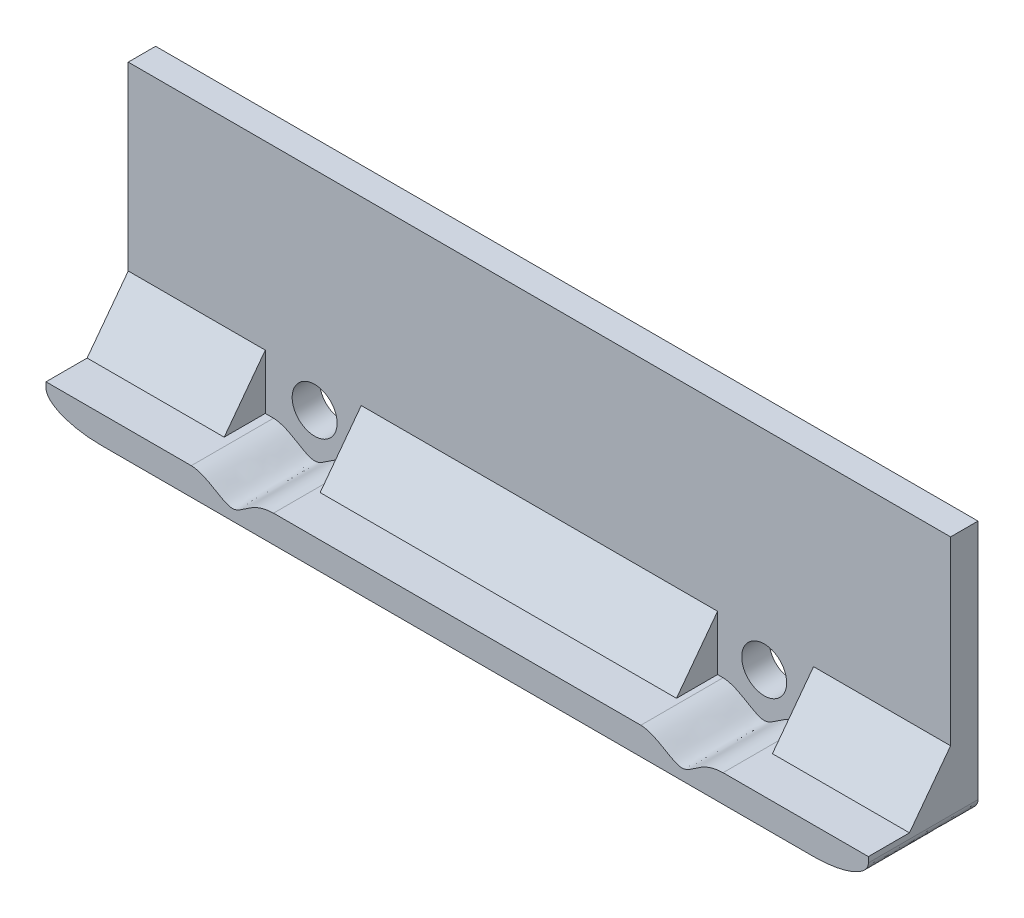
ISO-10303-21;
HEADER;
FILE_DESCRIPTION(('STEP AP214'),'2;1');
FILE_NAME('part.step','',(''),(''),'','','');
FILE_SCHEMA(('AUTOMOTIVE_DESIGN { 1 0 10303 214 1 1 1 1 }'));
ENDSEC;
DATA;
#1=APPLICATION_CONTEXT('core data for automotive mechanical design processes');
#2=APPLICATION_PROTOCOL_DEFINITION('international standard','automotive_design',2000,#1);
#3=PRODUCT_CONTEXT('',#1,'mechanical');
#4=PRODUCT('Part','Part','',(#3));
#5=PRODUCT_RELATED_PRODUCT_CATEGORY('part','',(#4));
#6=PRODUCT_DEFINITION_FORMATION('','',#4);
#7=PRODUCT_DEFINITION_CONTEXT('part definition',#1,'design');
#8=PRODUCT_DEFINITION('design','',#6,#7);
#9=PRODUCT_DEFINITION_SHAPE('','',#8);
#10=(LENGTH_UNIT() NAMED_UNIT(*) SI_UNIT(.MILLI.,.METRE.));
#11=(NAMED_UNIT(*) PLANE_ANGLE_UNIT() SI_UNIT($,.RADIAN.));
#12=(NAMED_UNIT(*) SI_UNIT($,.STERADIAN.) SOLID_ANGLE_UNIT());
#13=UNCERTAINTY_MEASURE_WITH_UNIT(LENGTH_MEASURE(1.E-05),#10,'distance_accuracy_value','');
#14=(GEOMETRIC_REPRESENTATION_CONTEXT(3) GLOBAL_UNCERTAINTY_ASSIGNED_CONTEXT((#13)) GLOBAL_UNIT_ASSIGNED_CONTEXT((#10,
#11,#12)) REPRESENTATION_CONTEXT('',''));
#15=CARTESIAN_POINT('',(0.,0.,0.));
#16=DIRECTION('',(0.,0.,1.));
#17=DIRECTION('',(1.,0.,0.));
#18=AXIS2_PLACEMENT_3D('',#15,#16,#17);
#19=CARTESIAN_POINT('',(0.,0.,5.));
#20=DIRECTION('',(0.,0.,-1.));
#21=DIRECTION('',(-1.,0.,0.));
#22=AXIS2_PLACEMENT_3D('',#19,#20,#21);
#23=PLANE('',#22);
#24=CARTESIAN_POINT('',(41.,10.,5.));
#25=DIRECTION('',(0.,0.,1.));
#26=DIRECTION('',(1.,0.,0.));
#27=AXIS2_PLACEMENT_3D('',#24,#25,#26);
#28=CIRCLE('',#27,4.1);
#29=CARTESIAN_POINT('',(45.1,10.,5.));
#30=VERTEX_POINT('',#29);
#31=EDGE_CURVE('E453',#30,#30,#28,.T.);
#32=ORIENTED_EDGE('',*,*,#31,.F.);
#33=EDGE_LOOP('',(#32));
#34=FACE_BOUND('',#33,.T.);
#35=CARTESIAN_POINT('',(-41.,9.99999999999999,5.));
#36=DIRECTION('',(0.,0.,1.));
#37=DIRECTION('',(1.,0.,0.));
#38=AXIS2_PLACEMENT_3D('',#35,#36,#37);
#39=CIRCLE('',#38,4.1);
#40=CARTESIAN_POINT('',(-36.9,9.99999999999999,5.));
#41=VERTEX_POINT('',#40);
#42=EDGE_CURVE('E366',#41,#41,#39,.T.);
#43=ORIENTED_EDGE('',*,*,#42,.F.);
#44=EDGE_LOOP('',(#43));
#45=FACE_BOUND('',#44,.T.);
#46=DIRECTION('',(1.,0.,0.));
#47=VECTOR('',#46,1.);
#48=CARTESIAN_POINT('',(0.,5.,5.));
#49=LINE('',#48,#47);
#50=CARTESIAN_POINT('',(-33.5,5.,5.));
#51=VERTEX_POINT('',#50);
#52=CARTESIAN_POINT('',(-32.5,4.99999999999545,4.99999999999545));
#53=VERTEX_POINT('',#52);
#54=EDGE_CURVE('E213',#51,#53,#49,.T.);
#55=ORIENTED_EDGE('',*,*,#54,.T.);
#56=DIRECTION('',(0.,1.,0.));
#57=VECTOR('',#56,1.);
#58=CARTESIAN_POINT('',(-32.5,-291521.0249875,4.99999999999545));
#59=LINE('',#58,#57);
#60=CARTESIAN_POINT('',(-32.5,15.0000000000432,4.99999999993861));
#61=VERTEX_POINT('',#60);
#62=EDGE_CURVE('E206',#53,#61,#59,.T.);
#63=ORIENTED_EDGE('',*,*,#62,.T.);
#64=DIRECTION('',(1.,0.,0.));
#65=VECTOR('',#64,1.);
#66=CARTESIAN_POINT('',(-32.5,15.0000000000432,4.99999999993861));
#67=LINE('',#66,#65);
#68=CARTESIAN_POINT('',(32.5,15.0000000000432,4.99999999993861));
#69=VERTEX_POINT('',#68);
#70=EDGE_CURVE('E189',#61,#69,#67,.T.);
#71=ORIENTED_EDGE('',*,*,#70,.T.);
#72=DIRECTION('',(0.,1.,0.));
#73=VECTOR('',#72,1.);
#74=CARTESIAN_POINT('',(32.5,-291521.0249875,4.99999999999545));
#75=LINE('',#74,#73);
#76=CARTESIAN_POINT('',(32.5,4.99999999999545,4.99999999999545));
#77=VERTEX_POINT('',#76);
#78=EDGE_CURVE('E222',#77,#69,#75,.T.);
#79=ORIENTED_EDGE('',*,*,#78,.F.);
#80=CARTESIAN_POINT('',(33.5,5.,5.));
#81=VERTEX_POINT('',#80);
#82=EDGE_CURVE('E475',#77,#81,#49,.T.);
#83=ORIENTED_EDGE('',*,*,#82,.T.);
#84=CARTESIAN_POINT('',(33.5,5.,5.));
#85=CARTESIAN_POINT('',(36.4768103069263,4.895138538773,5.));
#86=CARTESIAN_POINT('',(41.6709900792615,-0.89512850250222,5.));
#87=CARTESIAN_POINT('',(44.1812095345506,4.89511846623144,5.));
#88=CARTESIAN_POINT('',(48.5,5.,5.));
#89=B_SPLINE_CURVE_WITH_KNOTS('',3,(#84,#85,#86,#87,#88),.UNSPECIFIED.,.F.,.F.,(4,1,4),(0.,0.5,
1.),.UNSPECIFIED.);
#90=CARTESIAN_POINT('',(48.5,5.,5.));
#91=VERTEX_POINT('',#90);
#92=EDGE_CURVE('E461',#81,#91,#89,.T.);
#93=ORIENTED_EDGE('',*,*,#92,.T.);
#94=DIRECTION('',(1.,0.,0.));
#95=VECTOR('',#94,1.);
#96=CARTESIAN_POINT('',(0.,5.,5.));
#97=LINE('',#96,#95);
#98=CARTESIAN_POINT('',(50.,5.,5.));
#99=VERTEX_POINT('',#98);
#100=EDGE_CURVE('E487',#91,#99,#97,.T.);
#101=ORIENTED_EDGE('',*,*,#100,.T.);
#102=DIRECTION('',(0.,-1.,0.));
#103=VECTOR('',#102,1.);
#104=CARTESIAN_POINT('',(50.,0.,5.));
#105=LINE('',#104,#103);
#106=CARTESIAN_POINT('',(50.,15.,5.));
#107=VERTEX_POINT('',#106);
#108=EDGE_CURVE('E234',#107,#99,#105,.T.);
#109=ORIENTED_EDGE('',*,*,#108,.F.);
#110=DIRECTION('',(1.,0.,0.));
#111=VECTOR('',#110,1.);
#112=CARTESIAN_POINT('',(50.,15.,5.));
#113=LINE('',#112,#111);
#114=CARTESIAN_POINT('',(75.,15.,5.));
#115=VERTEX_POINT('',#114);
#116=EDGE_CURVE('E249',#107,#115,#113,.T.);
#117=ORIENTED_EDGE('',*,*,#116,.T.);
#118=DIRECTION('',(0.,1.,0.));
#119=VECTOR('',#118,1.);
#120=CARTESIAN_POINT('',(75.,0.,5.));
#121=LINE('',#120,#119);
#122=CARTESIAN_POINT('',(75.,48.,5.));
#123=VERTEX_POINT('',#122);
#124=EDGE_CURVE('E436',#115,#123,#121,.T.);
#125=ORIENTED_EDGE('',*,*,#124,.T.);
#126=DIRECTION('',(-1.,0.,0.));
#127=VECTOR('',#126,1.);
#128=CARTESIAN_POINT('',(-75.,48.,5.));
#129=LINE('',#128,#127);
#130=CARTESIAN_POINT('',(-75.,48.,5.));
#131=VERTEX_POINT('',#130);
#132=EDGE_CURVE('E370',#123,#131,#129,.T.);
#133=ORIENTED_EDGE('',*,*,#132,.T.);
#134=DIRECTION('',(0.,-1.,0.));
#135=VECTOR('',#134,1.);
#136=CARTESIAN_POINT('',(-75.,0.,5.));
#137=LINE('',#136,#135);
#138=CARTESIAN_POINT('',(-75.,15.,5.));
#139=VERTEX_POINT('',#138);
#140=EDGE_CURVE('E433',#131,#139,#137,.T.);
#141=ORIENTED_EDGE('',*,*,#140,.T.);
#142=DIRECTION('',(-1.,0.,0.));
#143=VECTOR('',#142,1.);
#144=CARTESIAN_POINT('',(-50.,15.,5.));
#145=LINE('',#144,#143);
#146=CARTESIAN_POINT('',(-50.,15.,5.));
#147=VERTEX_POINT('',#146);
#148=EDGE_CURVE('E269',#147,#139,#145,.T.);
#149=ORIENTED_EDGE('',*,*,#148,.F.);
#150=DIRECTION('',(0.,-1.,0.));
#151=VECTOR('',#150,1.);
#152=CARTESIAN_POINT('',(-50.,15.,5.));
#153=LINE('',#152,#151);
#154=CARTESIAN_POINT('',(-50.,5.,5.));
#155=VERTEX_POINT('',#154);
#156=EDGE_CURVE('E253',#147,#155,#153,.T.);
#157=ORIENTED_EDGE('',*,*,#156,.T.);
#158=DIRECTION('',(1.,0.,0.));
#159=VECTOR('',#158,1.);
#160=CARTESIAN_POINT('',(0.,5.,5.));
#161=LINE('',#160,#159);
#162=CARTESIAN_POINT('',(-48.5,5.,5.));
#163=VERTEX_POINT('',#162);
#164=EDGE_CURVE('E481',#155,#163,#161,.T.);
#165=ORIENTED_EDGE('',*,*,#164,.T.);
#166=CARTESIAN_POINT('',(-48.5,5.,5.));
#167=CARTESIAN_POINT('',(-45.5231896930737,4.895138538773,5.));
#168=CARTESIAN_POINT('',(-40.3290099207385,-0.895128502502221,5.));
#169=CARTESIAN_POINT('',(-37.8187904654494,4.89511846623144,5.));
#170=CARTESIAN_POINT('',(-33.5,5.,5.));
#171=B_SPLINE_CURVE_WITH_KNOTS('',3,(#166,#167,#168,#169,#170),.UNSPECIFIED.,.F.,.F.,(4,1,4),
(0.,0.5,1.),.UNSPECIFIED.);
#172=EDGE_CURVE('E476',#163,#51,#171,.T.);
#173=ORIENTED_EDGE('',*,*,#172,.T.);
#174=EDGE_LOOP('',(#55,#63,#71,#79,#83,#93,#101,#109,#117,#125,#133,#141,#149,#157,#165,#173));
#175=FACE_BOUND('',#174,.T.);
#176=ADVANCED_FACE('F50',(#34,#45,#175),#23,.F.);
#177=CARTESIAN_POINT('',(0.,5.,20.));
#178=DIRECTION('',(0.,1.,0.));
#179=DIRECTION('',(0.,0.,1.));
#180=AXIS2_PLACEMENT_3D('',#177,#178,#179);
#181=PLANE('',#180);
#182=DIRECTION('',(0.,0.,-1.));
#183=VECTOR('',#182,1.);
#184=CARTESIAN_POINT('',(75.,5.,20.));
#185=LINE('',#184,#183);
#186=CARTESIAN_POINT('',(75.,5.,20.));
#187=VERTEX_POINT('',#186);
#188=CARTESIAN_POINT('',(75.,5.,12.5));
#189=VERTEX_POINT('',#188);
#190=EDGE_CURVE('E506',#187,#189,#185,.T.);
#191=ORIENTED_EDGE('',*,*,#190,.T.);
#192=DIRECTION('',(1.,0.,0.));
#193=VECTOR('',#192,1.);
#194=CARTESIAN_POINT('',(50.,5.,12.5));
#195=LINE('',#194,#193);
#196=CARTESIAN_POINT('',(50.,5.,12.5));
#197=VERTEX_POINT('',#196);
#198=EDGE_CURVE('E242',#197,#189,#195,.T.);
#199=ORIENTED_EDGE('',*,*,#198,.F.);
#200=DIRECTION('',(0.,0.,1.));
#201=VECTOR('',#200,1.);
#202=CARTESIAN_POINT('',(50.,5.,5.));
#203=LINE('',#202,#201);
#204=EDGE_CURVE('E238',#99,#197,#203,.T.);
#205=ORIENTED_EDGE('',*,*,#204,.F.);
#206=ORIENTED_EDGE('',*,*,#100,.F.);
#207=DIRECTION('',(0.,0.,-1.));
#208=VECTOR('',#207,1.);
#209=CARTESIAN_POINT('',(48.5,5.,20.));
#210=LINE('',#209,#208);
#211=CARTESIAN_POINT('',(48.5,5.,20.));
#212=VERTEX_POINT('',#211);
#213=EDGE_CURVE('E393',#212,#91,#210,.T.);
#214=ORIENTED_EDGE('',*,*,#213,.F.);
#215=DIRECTION('',(1.,0.,0.));
#216=VECTOR('',#215,1.);
#217=CARTESIAN_POINT('',(0.,5.,20.));
#218=LINE('',#217,#216);
#219=EDGE_CURVE('E399',#212,#187,#218,.T.);
#220=ORIENTED_EDGE('',*,*,#219,.T.);
#221=EDGE_LOOP('',(#191,#199,#205,#206,#214,#220));
#222=FACE_BOUND('',#221,.T.);
#223=ADVANCED_FACE('F307',(#222),#181,.T.);
#224=CARTESIAN_POINT('',(0.,0.,0.));
#225=DIRECTION('',(0.,0.,-1.));
#226=DIRECTION('',(-1.,0.,0.));
#227=AXIS2_PLACEMENT_3D('',#224,#225,#226);
#228=PLANE('',#227);
#229=DIRECTION('',(0.,1.,0.));
#230=VECTOR('',#229,1.);
#231=CARTESIAN_POINT('',(75.,0.,0.));
#232=LINE('',#231,#230);
#233=CARTESIAN_POINT('',(75.,4.00000000000002,0.));
#234=VERTEX_POINT('',#233);
#235=CARTESIAN_POINT('',(75.,48.,0.));
#236=VERTEX_POINT('',#235);
#237=EDGE_CURVE('E379',#234,#236,#232,.T.);
#238=ORIENTED_EDGE('',*,*,#237,.F.);
#239=CARTESIAN_POINT('',(65.,0.,0.));
#240=CARTESIAN_POINT('',(75.,0.,0.));
#241=CARTESIAN_POINT('',(75.,4.00000000000002,0.));
#242=(BOUNDED_CURVE() B_SPLINE_CURVE(2,(#239,#240,#241),.UNSPECIFIED.,.F.,
.F.) B_SPLINE_CURVE_WITH_KNOTS((3,3),(0.,1.),
.UNSPECIFIED.) CURVE() GEOMETRIC_REPRESENTATION_ITEM() RATIONAL_B_SPLINE_CURVE((1.,
0.707106781186547,1.)) REPRESENTATION_ITEM(''));
#243=CARTESIAN_POINT('',(65.,0.,0.));
#244=VERTEX_POINT('',#243);
#245=EDGE_CURVE('E80',#234,#244,#242,.F.);
#246=ORIENTED_EDGE('',*,*,#245,.T.);
#247=DIRECTION('',(1.,0.,0.));
#248=VECTOR('',#247,1.);
#249=CARTESIAN_POINT('',(-75.,0.,0.));
#250=LINE('',#249,#248);
#251=CARTESIAN_POINT('',(-65.,0.,0.));
#252=VERTEX_POINT('',#251);
#253=EDGE_CURVE('E365',#252,#244,#250,.T.);
#254=ORIENTED_EDGE('',*,*,#253,.F.);
#255=CARTESIAN_POINT('',(-75.,4.,0.));
#256=CARTESIAN_POINT('',(-75.,0.,0.));
#257=CARTESIAN_POINT('',(-65.,0.,0.));
#258=(BOUNDED_CURVE() B_SPLINE_CURVE(2,(#255,#256,#257),.UNSPECIFIED.,.F.,
.F.) B_SPLINE_CURVE_WITH_KNOTS((3,3),(0.,1.),
.UNSPECIFIED.) CURVE() GEOMETRIC_REPRESENTATION_ITEM() RATIONAL_B_SPLINE_CURVE((1.,
0.707106781186548,1.)) REPRESENTATION_ITEM(''));
#259=CARTESIAN_POINT('',(-75.,4.,0.));
#260=VERTEX_POINT('',#259);
#261=EDGE_CURVE('E612',#252,#260,#258,.F.);
#262=ORIENTED_EDGE('',*,*,#261,.T.);
#263=DIRECTION('',(0.,-1.,0.));
#264=VECTOR('',#263,1.);
#265=CARTESIAN_POINT('',(-75.,0.,0.));
#266=LINE('',#265,#264);
#267=CARTESIAN_POINT('',(-75.,48.,0.));
#268=VERTEX_POINT('',#267);
#269=EDGE_CURVE('E356',#268,#260,#266,.T.);
#270=ORIENTED_EDGE('',*,*,#269,.F.);
#271=DIRECTION('',(-1.,0.,0.));
#272=VECTOR('',#271,1.);
#273=CARTESIAN_POINT('',(-75.,48.,0.));
#274=LINE('',#273,#272);
#275=EDGE_CURVE('E405',#236,#268,#274,.T.);
#276=ORIENTED_EDGE('',*,*,#275,.F.);
#277=EDGE_LOOP('',(#238,#246,#254,#262,#270,#276));
#278=FACE_BOUND('',#277,.T.);
#279=CARTESIAN_POINT('',(-41.,9.99999999999999,0.));
#280=DIRECTION('',(0.,0.,1.));
#281=DIRECTION('',(1.,0.,0.));
#282=AXIS2_PLACEMENT_3D('',#279,#280,#281);
#283=CIRCLE('',#282,4.1);
#284=CARTESIAN_POINT('',(-36.9,9.99999999999999,0.));
#285=VERTEX_POINT('',#284);
#286=EDGE_CURVE('E449',#285,#285,#283,.T.);
#287=ORIENTED_EDGE('',*,*,#286,.T.);
#288=EDGE_LOOP('',(#287));
#289=FACE_BOUND('',#288,.T.);
#290=CARTESIAN_POINT('',(41.,10.,0.));
#291=DIRECTION('',(0.,0.,1.));
#292=DIRECTION('',(1.,0.,0.));
#293=AXIS2_PLACEMENT_3D('',#290,#291,#292);
#294=CIRCLE('',#293,4.1);
#295=CARTESIAN_POINT('',(45.1,10.,0.));
#296=VERTEX_POINT('',#295);
#297=EDGE_CURVE('E457',#296,#296,#294,.T.);
#298=ORIENTED_EDGE('',*,*,#297,.T.);
#299=EDGE_LOOP('',(#298));
#300=FACE_BOUND('',#299,.T.);
#301=ADVANCED_FACE('F309',(#278,#289,#300),#228,.T.);
#302=CARTESIAN_POINT('',(-75.,0.,5.));
#303=DIRECTION('',(1.,0.,0.));
#304=DIRECTION('',(0.,0.,-1.));
#305=AXIS2_PLACEMENT_3D('',#302,#303,#304);
#306=PLANE('',#305);
#307=ORIENTED_EDGE('',*,*,#269,.T.);
#308=CARTESIAN_POINT('',(-75.,4.,21.));
#309=CARTESIAN_POINT('',(-75.,4.,13.6666666666667));
#310=CARTESIAN_POINT('',(-75.,4.,6.33333333333333));
#311=CARTESIAN_POINT('',(-75.,4.,-0.999999999999997));
#312=(BOUNDED_CURVE() B_SPLINE_CURVE(3,(#308,#309,#310,#311),.UNSPECIFIED.,.F.,
.F.) B_SPLINE_CURVE_WITH_KNOTS((4,4),(-0.016,0.006),
.UNSPECIFIED.) CURVE() GEOMETRIC_REPRESENTATION_ITEM() RATIONAL_B_SPLINE_CURVE((1.,1.,1.,1.)) REPRESENTATION_ITEM(''));
#313=CARTESIAN_POINT('',(-75.,4.,20.));
#314=VERTEX_POINT('',#313);
#315=EDGE_CURVE('E544',#260,#314,#312,.F.);
#316=ORIENTED_EDGE('',*,*,#315,.T.);
#317=DIRECTION('',(0.,1.,0.));
#318=VECTOR('',#317,1.);
#319=CARTESIAN_POINT('',(-75.,0.,20.));
#320=LINE('',#319,#318);
#321=CARTESIAN_POINT('',(-75.,5.,20.));
#322=VERTEX_POINT('',#321);
#323=EDGE_CURVE('E386',#314,#322,#320,.T.);
#324=ORIENTED_EDGE('',*,*,#323,.T.);
#325=DIRECTION('',(0.,0.,-1.));
#326=VECTOR('',#325,1.);
#327=CARTESIAN_POINT('',(-75.,5.,20.));
#328=LINE('',#327,#326);
#329=CARTESIAN_POINT('',(-75.,5.,12.5));
#330=VERTEX_POINT('',#329);
#331=EDGE_CURVE('E503',#322,#330,#328,.T.);
#332=ORIENTED_EDGE('',*,*,#331,.T.);
#333=DIRECTION('',(0.,0.8,-0.6));
#334=VECTOR('',#333,1.);
#335=CARTESIAN_POINT('',(-75.,5.,12.5));
#336=LINE('',#335,#334);
#337=EDGE_CURVE('E252',#330,#139,#336,.T.);
#338=ORIENTED_EDGE('',*,*,#337,.T.);
#339=ORIENTED_EDGE('',*,*,#140,.F.);
#340=DIRECTION('',(0.,0.,-1.));
#341=VECTOR('',#340,1.);
#342=CARTESIAN_POINT('',(-75.,48.,5.));
#343=LINE('',#342,#341);
#344=EDGE_CURVE('E438',#131,#268,#343,.T.);
#345=ORIENTED_EDGE('',*,*,#344,.T.);
#346=EDGE_LOOP('',(#307,#316,#324,#332,#338,#339,#345));
#347=FACE_BOUND('',#346,.T.);
#348=ADVANCED_FACE('F313',(#347),#306,.F.);
#349=CARTESIAN_POINT('',(-75.,0.,5.));
#350=DIRECTION('',(0.,1.,0.));
#351=DIRECTION('',(-1.,0.,0.));
#352=AXIS2_PLACEMENT_3D('',#349,#350,#351);
#353=PLANE('',#352);
#354=ORIENTED_EDGE('',*,*,#253,.T.);
#355=CARTESIAN_POINT('',(65.,0.,21.));
#356=CARTESIAN_POINT('',(65.,0.,13.6666666666667));
#357=CARTESIAN_POINT('',(65.,0.,6.33333333333333));
#358=CARTESIAN_POINT('',(65.,0.,-0.999999999999997));
#359=(BOUNDED_CURVE() B_SPLINE_CURVE(3,(#355,#356,#357,#358),.UNSPECIFIED.,.F.,
.F.) B_SPLINE_CURVE_WITH_KNOTS((4,4),(-0.016,0.006),
.UNSPECIFIED.) CURVE() GEOMETRIC_REPRESENTATION_ITEM() RATIONAL_B_SPLINE_CURVE((1.,1.,1.,1.)) REPRESENTATION_ITEM(''));
#360=CARTESIAN_POINT('',(65.,0.,20.));
#361=VERTEX_POINT('',#360);
#362=EDGE_CURVE('E65',#244,#361,#359,.F.);
#363=ORIENTED_EDGE('',*,*,#362,.T.);
#364=DIRECTION('',(1.,0.,0.));
#365=VECTOR('',#364,1.);
#366=CARTESIAN_POINT('',(0.,0.,20.));
#367=LINE('',#366,#365);
#368=CARTESIAN_POINT('',(-65.,0.,20.));
#369=VERTEX_POINT('',#368);
#370=EDGE_CURVE('E382',#369,#361,#367,.T.);
#371=ORIENTED_EDGE('',*,*,#370,.F.);
#372=CARTESIAN_POINT('',(-65.,0.,-0.999999999999997));
#373=CARTESIAN_POINT('',(-65.,0.,6.33333333333333));
#374=CARTESIAN_POINT('',(-65.,0.,13.6666666666667));
#375=CARTESIAN_POINT('',(-65.,0.,21.));
#376=(BOUNDED_CURVE() B_SPLINE_CURVE(3,(#372,#373,#374,#375),.UNSPECIFIED.,.F.,
.F.) B_SPLINE_CURVE_WITH_KNOTS((4,4),(-0.016,0.006),
.UNSPECIFIED.) CURVE() GEOMETRIC_REPRESENTATION_ITEM() RATIONAL_B_SPLINE_CURVE((1.,1.,1.,1.)) REPRESENTATION_ITEM(''));
#377=EDGE_CURVE('E444',#369,#252,#376,.F.);
#378=ORIENTED_EDGE('',*,*,#377,.T.);
#379=EDGE_LOOP('',(#354,#363,#371,#378));
#380=FACE_BOUND('',#379,.T.);
#381=ADVANCED_FACE('F336',(#380),#353,.F.);
#382=CARTESIAN_POINT('',(75.,0.,5.));
#383=DIRECTION('',(-1.,0.,0.));
#384=DIRECTION('',(0.,-1.,0.));
#385=AXIS2_PLACEMENT_3D('',#382,#383,#384);
#386=PLANE('',#385);
#387=DIRECTION('',(0.,1.,0.));
#388=VECTOR('',#387,1.);
#389=CARTESIAN_POINT('',(75.,0.,20.));
#390=LINE('',#389,#388);
#391=CARTESIAN_POINT('',(75.,4.00000000000002,20.));
#392=VERTEX_POINT('',#391);
#393=EDGE_CURVE('E385',#392,#187,#390,.T.);
#394=ORIENTED_EDGE('',*,*,#393,.F.);
#395=CARTESIAN_POINT('',(75.,4.00000000000002,-0.999999999999997));
#396=CARTESIAN_POINT('',(75.,4.00000000000002,6.33333333333333));
#397=CARTESIAN_POINT('',(75.,4.00000000000002,13.6666666666667));
#398=CARTESIAN_POINT('',(75.,4.00000000000002,21.));
#399=(BOUNDED_CURVE() B_SPLINE_CURVE(3,(#395,#396,#397,#398),.UNSPECIFIED.,.F.,
.F.) B_SPLINE_CURVE_WITH_KNOTS((4,4),(-0.016,0.006),
.UNSPECIFIED.) CURVE() GEOMETRIC_REPRESENTATION_ITEM() RATIONAL_B_SPLINE_CURVE((1.,1.,1.,1.)) REPRESENTATION_ITEM(''));
#400=EDGE_CURVE('E410',#392,#234,#399,.F.);
#401=ORIENTED_EDGE('',*,*,#400,.T.);
#402=ORIENTED_EDGE('',*,*,#237,.T.);
#403=DIRECTION('',(0.,0.,-1.));
#404=VECTOR('',#403,1.);
#405=CARTESIAN_POINT('',(75.,48.,5.));
#406=LINE('',#405,#404);
#407=EDGE_CURVE('E380',#123,#236,#406,.T.);
#408=ORIENTED_EDGE('',*,*,#407,.F.);
#409=ORIENTED_EDGE('',*,*,#124,.F.);
#410=DIRECTION('',(0.,0.8,-0.6));
#411=VECTOR('',#410,1.);
#412=CARTESIAN_POINT('',(75.,5.40000000000001,12.2));
#413=LINE('',#412,#411);
#414=EDGE_CURVE('E228',#189,#115,#413,.T.);
#415=ORIENTED_EDGE('',*,*,#414,.F.);
#416=ORIENTED_EDGE('',*,*,#190,.F.);
#417=EDGE_LOOP('',(#394,#401,#402,#408,#409,#415,#416));
#418=FACE_BOUND('',#417,.T.);
#419=ADVANCED_FACE('F345',(#418),#386,.F.);
#420=CARTESIAN_POINT('',(-75.,48.,5.));
#421=DIRECTION('',(0.,-1.,0.));
#422=DIRECTION('',(1.,0.,0.));
#423=AXIS2_PLACEMENT_3D('',#420,#421,#422);
#424=PLANE('',#423);
#425=ORIENTED_EDGE('',*,*,#275,.T.);
#426=ORIENTED_EDGE('',*,*,#344,.F.);
#427=ORIENTED_EDGE('',*,*,#132,.F.);
#428=ORIENTED_EDGE('',*,*,#407,.T.);
#429=EDGE_LOOP('',(#425,#426,#427,#428));
#430=FACE_BOUND('',#429,.T.);
#431=ADVANCED_FACE('F303',(#430),#424,.F.);
#432=CARTESIAN_POINT('',(-41.,9.99999999999999,5.));
#433=DIRECTION('',(0.,0.,-1.));
#434=DIRECTION('',(-1.,0.,0.));
#435=AXIS2_PLACEMENT_3D('',#432,#433,#434);
#436=CYLINDRICAL_SURFACE('',#435,4.1);
#437=ORIENTED_EDGE('',*,*,#42,.T.);
#438=EDGE_LOOP('',(#437));
#439=FACE_BOUND('',#438,.T.);
#440=ORIENTED_EDGE('',*,*,#286,.F.);
#441=EDGE_LOOP('',(#440));
#442=FACE_BOUND('',#441,.T.);
#443=ADVANCED_FACE('F299',(#439,#442),#436,.F.);
#444=CARTESIAN_POINT('',(41.,10.,5.));
#445=DIRECTION('',(0.,0.,-1.));
#446=DIRECTION('',(-1.,0.,0.));
#447=AXIS2_PLACEMENT_3D('',#444,#445,#446);
#448=CYLINDRICAL_SURFACE('',#447,4.1);
#449=ORIENTED_EDGE('',*,*,#31,.T.);
#450=EDGE_LOOP('',(#449));
#451=FACE_BOUND('',#450,.T.);
#452=ORIENTED_EDGE('',*,*,#297,.F.);
#453=EDGE_LOOP('',(#452));
#454=FACE_BOUND('',#453,.T.);
#455=ADVANCED_FACE('F293',(#451,#454),#448,.F.);
#456=CARTESIAN_POINT('',(33.5,5.,20.));
#457=CARTESIAN_POINT('',(36.4768103069263,4.895138538773,20.));
#458=CARTESIAN_POINT('',(41.6709900792615,-0.89512850250222,20.));
#459=CARTESIAN_POINT('',(44.1812095345506,4.89511846623144,20.));
#460=CARTESIAN_POINT('',(48.5,5.,20.));
#461=B_SPLINE_CURVE_WITH_KNOTS('',3,(#456,#457,#458,#459,#460),.UNSPECIFIED.,.F.,.F.,(4,1,4),
(0.,0.5,1.),.UNSPECIFIED.);
#462=DIRECTION('',(0.,0.,-1.));
#463=VECTOR('',#462,1.);
#464=SURFACE_OF_LINEAR_EXTRUSION('',#461,#463);
#465=ORIENTED_EDGE('',*,*,#92,.F.);
#466=DIRECTION('',(0.,0.,-1.));
#467=VECTOR('',#466,1.);
#468=CARTESIAN_POINT('',(33.5,5.,20.));
#469=LINE('',#468,#467);
#470=CARTESIAN_POINT('',(33.5,5.,20.));
#471=VERTEX_POINT('',#470);
#472=EDGE_CURVE('E491',#471,#81,#469,.T.);
#473=ORIENTED_EDGE('',*,*,#472,.F.);
#474=EDGE_CURVE('E272',#471,#212,#461,.T.);
#475=ORIENTED_EDGE('',*,*,#474,.T.);
#476=ORIENTED_EDGE('',*,*,#213,.T.);
#477=EDGE_LOOP('',(#465,#473,#475,#476));
#478=FACE_BOUND('',#477,.T.);
#479=ADVANCED_FACE('F288',(#478),#464,.T.);
#480=DIRECTION('',(0.,0.,-1.));
#481=VECTOR('',#480,1.);
#482=CARTESIAN_POINT('',(-32.5,4.99999999999545,400010.));
#483=LINE('',#482,#481);
#484=CARTESIAN_POINT('',(-32.5,4.99999999999545,12.4999999999318));
#485=VERTEX_POINT('',#484);
#486=EDGE_CURVE('E202',#485,#53,#483,.T.);
#487=ORIENTED_EDGE('',*,*,#486,.T.);
#488=ORIENTED_EDGE('',*,*,#54,.F.);
#489=DIRECTION('',(0.,0.,-1.));
#490=VECTOR('',#489,1.);
#491=CARTESIAN_POINT('',(-33.5,5.,20.));
#492=LINE('',#491,#490);
#493=CARTESIAN_POINT('',(-33.5,5.,20.));
#494=VERTEX_POINT('',#493);
#495=EDGE_CURVE('E495',#494,#51,#492,.T.);
#496=ORIENTED_EDGE('',*,*,#495,.F.);
#497=EDGE_CURVE('E282',#494,#471,#218,.T.);
#498=ORIENTED_EDGE('',*,*,#497,.T.);
#499=ORIENTED_EDGE('',*,*,#472,.T.);
#500=ORIENTED_EDGE('',*,*,#82,.F.);
#501=DIRECTION('',(0.,0.,-1.));
#502=VECTOR('',#501,1.);
#503=CARTESIAN_POINT('',(32.5,4.99999999999545,400010.));
#504=LINE('',#503,#502);
#505=CARTESIAN_POINT('',(32.5,5.,12.4999999999318));
#506=VERTEX_POINT('',#505);
#507=EDGE_CURVE('E215',#506,#77,#504,.T.);
#508=ORIENTED_EDGE('',*,*,#507,.F.);
#509=DIRECTION('',(1.,0.,0.));
#510=VECTOR('',#509,1.);
#511=CARTESIAN_POINT('',(-32.5,4.99999999999545,12.4999999999318));
#512=LINE('',#511,#510);
#513=EDGE_CURVE('E201',#485,#506,#512,.T.);
#514=ORIENTED_EDGE('',*,*,#513,.F.);
#515=EDGE_LOOP('',(#487,#488,#496,#498,#499,#500,#508,#514));
#516=FACE_BOUND('',#515,.T.);
#517=ADVANCED_FACE('F292',(#516),#181,.T.);
#518=CARTESIAN_POINT('',(-48.5,5.,20.));
#519=CARTESIAN_POINT('',(-45.5231896930737,4.895138538773,20.));
#520=CARTESIAN_POINT('',(-40.3290099207385,-0.895128502502221,20.));
#521=CARTESIAN_POINT('',(-37.8187904654494,4.89511846623144,20.));
#522=CARTESIAN_POINT('',(-33.5,5.,20.));
#523=B_SPLINE_CURVE_WITH_KNOTS('',3,(#518,#519,#520,#521,#522),.UNSPECIFIED.,.F.,.F.,(4,1,4),
(0.,0.5,1.),.UNSPECIFIED.);
#524=DIRECTION('',(0.,0.,-1.));
#525=VECTOR('',#524,1.);
#526=SURFACE_OF_LINEAR_EXTRUSION('',#523,#525);
#527=ORIENTED_EDGE('',*,*,#172,.F.);
#528=DIRECTION('',(0.,0.,-1.));
#529=VECTOR('',#528,1.);
#530=CARTESIAN_POINT('',(-48.5,5.,20.));
#531=LINE('',#530,#529);
#532=CARTESIAN_POINT('',(-48.5,5.,20.));
#533=VERTEX_POINT('',#532);
#534=EDGE_CURVE('E499',#533,#163,#531,.T.);
#535=ORIENTED_EDGE('',*,*,#534,.F.);
#536=EDGE_CURVE('E518',#533,#494,#523,.T.);
#537=ORIENTED_EDGE('',*,*,#536,.T.);
#538=ORIENTED_EDGE('',*,*,#495,.T.);
#539=EDGE_LOOP('',(#527,#535,#537,#538));
#540=FACE_BOUND('',#539,.T.);
#541=ADVANCED_FACE('F295',(#540),#526,.T.);
#542=DIRECTION('',(-1.,0.,0.));
#543=VECTOR('',#542,1.);
#544=CARTESIAN_POINT('',(-50.,5.,12.5));
#545=LINE('',#544,#543);
#546=CARTESIAN_POINT('',(-50.,5.,12.5));
#547=VERTEX_POINT('',#546);
#548=EDGE_CURVE('E265',#547,#330,#545,.T.);
#549=ORIENTED_EDGE('',*,*,#548,.T.);
#550=ORIENTED_EDGE('',*,*,#331,.F.);
#551=EDGE_CURVE('E514',#322,#533,#218,.T.);
#552=ORIENTED_EDGE('',*,*,#551,.T.);
#553=ORIENTED_EDGE('',*,*,#534,.T.);
#554=ORIENTED_EDGE('',*,*,#164,.F.);
#555=DIRECTION('',(0.,0.,1.));
#556=VECTOR('',#555,1.);
#557=CARTESIAN_POINT('',(-50.,5.,5.));
#558=LINE('',#557,#556);
#559=EDGE_CURVE('E257',#155,#547,#558,.T.);
#560=ORIENTED_EDGE('',*,*,#559,.T.);
#561=EDGE_LOOP('',(#549,#550,#552,#553,#554,#560));
#562=FACE_BOUND('',#561,.T.);
#563=ADVANCED_FACE('F541',(#562),#181,.T.);
#564=CARTESIAN_POINT('',(0.,0.,20.));
#565=DIRECTION('',(0.,0.,1.));
#566=DIRECTION('',(1.,0.,0.));
#567=AXIS2_PLACEMENT_3D('',#564,#565,#566);
#568=PLANE('',#567);
#569=ORIENTED_EDGE('',*,*,#370,.T.);
#570=CARTESIAN_POINT('',(75.,4.00000000000002,20.));
#571=CARTESIAN_POINT('',(75.,0.,20.));
#572=CARTESIAN_POINT('',(65.,0.,20.));
#573=(BOUNDED_CURVE() B_SPLINE_CURVE(2,(#570,#571,#572),.UNSPECIFIED.,.F.,
.F.) B_SPLINE_CURVE_WITH_KNOTS((3,3),(0.,1.),
.UNSPECIFIED.) CURVE() GEOMETRIC_REPRESENTATION_ITEM() RATIONAL_B_SPLINE_CURVE((1.,
0.707106781186547,1.)) REPRESENTATION_ITEM(''));
#574=EDGE_CURVE('E12',#361,#392,#573,.F.);
#575=ORIENTED_EDGE('',*,*,#574,.T.);
#576=ORIENTED_EDGE('',*,*,#393,.T.);
#577=ORIENTED_EDGE('',*,*,#219,.F.);
#578=ORIENTED_EDGE('',*,*,#474,.F.);
#579=ORIENTED_EDGE('',*,*,#497,.F.);
#580=ORIENTED_EDGE('',*,*,#536,.F.);
#581=ORIENTED_EDGE('',*,*,#551,.F.);
#582=ORIENTED_EDGE('',*,*,#323,.F.);
#583=CARTESIAN_POINT('',(-65.,0.,20.));
#584=CARTESIAN_POINT('',(-75.,0.,20.));
#585=CARTESIAN_POINT('',(-75.,4.,20.));
#586=(BOUNDED_CURVE() B_SPLINE_CURVE(2,(#583,#584,#585),.UNSPECIFIED.,.F.,
.F.) B_SPLINE_CURVE_WITH_KNOTS((3,3),(0.,1.),
.UNSPECIFIED.) CURVE() GEOMETRIC_REPRESENTATION_ITEM() RATIONAL_B_SPLINE_CURVE((1.,
0.707106781186548,1.)) REPRESENTATION_ITEM(''));
#587=EDGE_CURVE('E425',#314,#369,#586,.F.);
#588=ORIENTED_EDGE('',*,*,#587,.T.);
#589=EDGE_LOOP('',(#569,#575,#576,#577,#578,#579,#580,#581,#582,#588));
#590=FACE_BOUND('',#589,.T.);
#591=ADVANCED_FACE('F536',(#590),#568,.T.);
#592=CARTESIAN_POINT('',(-50.,5.,12.5));
#593=DIRECTION('',(0.,0.6,0.8));
#594=DIRECTION('',(0.,-0.8,0.6));
#595=AXIS2_PLACEMENT_3D('',#592,#593,#594);
#596=PLANE('',#595);
#597=ORIENTED_EDGE('',*,*,#337,.F.);
#598=ORIENTED_EDGE('',*,*,#548,.F.);
#599=DIRECTION('',(0.,0.8,-0.6));
#600=VECTOR('',#599,1.);
#601=CARTESIAN_POINT('',(-50.,5.,12.5));
#602=LINE('',#601,#600);
#603=EDGE_CURVE('E261',#547,#147,#602,.T.);
#604=ORIENTED_EDGE('',*,*,#603,.T.);
#605=ORIENTED_EDGE('',*,*,#148,.T.);
#606=EDGE_LOOP('',(#597,#598,#604,#605));
#607=FACE_BOUND('',#606,.T.);
#608=ADVANCED_FACE('F571',(#607),#596,.T.);
#609=CARTESIAN_POINT('',(-50.,0.,0.));
#610=DIRECTION('',(-1.,0.,0.));
#611=DIRECTION('',(0.,0.,1.));
#612=AXIS2_PLACEMENT_3D('',#609,#610,#611);
#613=PLANE('',#612);
#614=ORIENTED_EDGE('',*,*,#156,.F.);
#615=ORIENTED_EDGE('',*,*,#603,.F.);
#616=ORIENTED_EDGE('',*,*,#559,.F.);
#617=EDGE_LOOP('',(#614,#615,#616));
#618=FACE_BOUND('',#617,.T.);
#619=ADVANCED_FACE('F714',(#618),#613,.F.);
#620=CARTESIAN_POINT('',(50.,5.40000000000001,12.2));
#621=DIRECTION('',(0.,-0.6,-0.8));
#622=DIRECTION('',(0.,0.8,-0.6));
#623=AXIS2_PLACEMENT_3D('',#620,#621,#622);
#624=PLANE('',#623);
#625=ORIENTED_EDGE('',*,*,#414,.T.);
#626=ORIENTED_EDGE('',*,*,#116,.F.);
#627=DIRECTION('',(0.,0.8,-0.6));
#628=VECTOR('',#627,1.);
#629=CARTESIAN_POINT('',(50.,5.40000000000001,12.2));
#630=LINE('',#629,#628);
#631=EDGE_CURVE('E230',#197,#107,#630,.T.);
#632=ORIENTED_EDGE('',*,*,#631,.F.);
#633=ORIENTED_EDGE('',*,*,#198,.T.);
#634=EDGE_LOOP('',(#625,#626,#632,#633));
#635=FACE_BOUND('',#634,.T.);
#636=ADVANCED_FACE('F711',(#635),#624,.F.);
#637=CARTESIAN_POINT('',(50.,0.,0.));
#638=DIRECTION('',(1.,0.,0.));
#639=DIRECTION('',(0.,1.,0.));
#640=AXIS2_PLACEMENT_3D('',#637,#638,#639);
#641=PLANE('',#640);
#642=ORIENTED_EDGE('',*,*,#631,.T.);
#643=ORIENTED_EDGE('',*,*,#108,.T.);
#644=ORIENTED_EDGE('',*,*,#204,.T.);
#645=EDGE_LOOP('',(#642,#643,#644));
#646=FACE_BOUND('',#645,.T.);
#647=ADVANCED_FACE('F708',(#646),#641,.F.);
#648=CARTESIAN_POINT('',(-32.5,-378570.455992,283944.091994));
#649=DIRECTION('',(0.,0.6,0.8));
#650=DIRECTION('',(0.,-0.8,0.6));
#651=AXIS2_PLACEMENT_3D('',#648,#649,#650);
#652=PLANE('',#651);
#653=DIRECTION('',(0.,-0.8,0.6));
#654=VECTOR('',#653,1.);
#655=CARTESIAN_POINT('',(32.5,-378570.455992,283944.091994));
#656=LINE('',#655,#654);
#657=EDGE_CURVE('E195',#69,#506,#656,.T.);
#658=ORIENTED_EDGE('',*,*,#657,.F.);
#659=ORIENTED_EDGE('',*,*,#70,.F.);
#660=DIRECTION('',(0.,-0.8,0.6));
#661=VECTOR('',#660,1.);
#662=CARTESIAN_POINT('',(-32.5,-378570.455992,283944.091994));
#663=LINE('',#662,#661);
#664=EDGE_CURVE('E193',#61,#485,#663,.T.);
#665=ORIENTED_EDGE('',*,*,#664,.T.);
#666=ORIENTED_EDGE('',*,*,#513,.T.);
#667=EDGE_LOOP('',(#658,#659,#665,#666));
#668=FACE_BOUND('',#667,.T.);
#669=ADVANCED_FACE('F191',(#668),#652,.T.);
#670=CARTESIAN_POINT('',(-32.5,0.,0.));
#671=DIRECTION('',(-1.,0.,0.));
#672=DIRECTION('',(0.,0.,1.));
#673=AXIS2_PLACEMENT_3D('',#670,#671,#672);
#674=PLANE('',#673);
#675=ORIENTED_EDGE('',*,*,#62,.F.);
#676=ORIENTED_EDGE('',*,*,#486,.F.);
#677=ORIENTED_EDGE('',*,*,#664,.F.);
#678=EDGE_LOOP('',(#675,#676,#677));
#679=FACE_BOUND('',#678,.T.);
#680=ADVANCED_FACE('F205',(#679),#674,.T.);
#681=CARTESIAN_POINT('',(32.5,0.,0.));
#682=DIRECTION('',(-1.,0.,0.));
#683=DIRECTION('',(0.,0.,1.));
#684=AXIS2_PLACEMENT_3D('',#681,#682,#683);
#685=PLANE('',#684);
#686=ORIENTED_EDGE('',*,*,#78,.T.);
#687=ORIENTED_EDGE('',*,*,#657,.T.);
#688=ORIENTED_EDGE('',*,*,#507,.T.);
#689=EDGE_LOOP('',(#686,#687,#688));
#690=FACE_BOUND('',#689,.T.);
#691=ADVANCED_FACE('F635',(#690),#685,.F.);
#692=CARTESIAN_POINT('',(-65.,0.,21.));
#693=CARTESIAN_POINT('',(-65.,0.,13.6666666666667));
#694=CARTESIAN_POINT('',(-65.,0.,6.33333333333333));
#695=CARTESIAN_POINT('',(-65.,0.,-0.999999999999997));
#696=CARTESIAN_POINT('',(-75.,0.,21.));
#697=CARTESIAN_POINT('',(-75.,0.,13.6666666666667));
#698=CARTESIAN_POINT('',(-75.,0.,6.33333333333334));
#699=CARTESIAN_POINT('',(-75.,0.,-0.999999999999997));
#700=CARTESIAN_POINT('',(-75.,4.,21.));
#701=CARTESIAN_POINT('',(-75.,4.,13.6666666666667));
#702=CARTESIAN_POINT('',(-75.,4.,6.33333333333333));
#703=CARTESIAN_POINT('',(-75.,4.,-0.999999999999997));
#704=(BOUNDED_SURFACE() B_SPLINE_SURFACE(2,3,((#692,#693,#694,#695),(#696,#697,#698,#699),(#700,
#701,#702,#703)),.UNSPECIFIED.,.F.,.F.,.F.) B_SPLINE_SURFACE_WITH_KNOTS((3,3),(4,4),(0.,1.),
(-0.016,0.006),.UNSPECIFIED.) GEOMETRIC_REPRESENTATION_ITEM() RATIONAL_B_SPLINE_SURFACE(((1.,1.,
1.,1.),(0.707106781186548,0.707106781186548,0.707106781186548,0.707106781186548),(1.,1.,1.,1.))) REPRESENTATION_ITEM('') SURFACE());
#705=ORIENTED_EDGE('',*,*,#587,.F.);
#706=ORIENTED_EDGE('',*,*,#315,.F.);
#707=ORIENTED_EDGE('',*,*,#261,.F.);
#708=ORIENTED_EDGE('',*,*,#377,.F.);
#709=EDGE_LOOP('',(#705,#706,#707,#708));
#710=FACE_BOUND('',#709,.T.);
#711=ADVANCED_FACE('F617',(#710),#704,.T.);
#712=CARTESIAN_POINT('',(75.,4.00000000000002,21.));
#713=CARTESIAN_POINT('',(75.,4.00000000000002,13.6666666666667));
#714=CARTESIAN_POINT('',(75.,4.00000000000002,6.33333333333333));
#715=CARTESIAN_POINT('',(75.,4.00000000000002,-0.999999999999997));
#716=CARTESIAN_POINT('',(75.,0.,21.));
#717=CARTESIAN_POINT('',(75.,0.,13.6666666666667));
#718=CARTESIAN_POINT('',(75.,0.,6.33333333333335));
#719=CARTESIAN_POINT('',(75.,0.,-0.999999999999997));
#720=CARTESIAN_POINT('',(65.,0.,21.));
#721=CARTESIAN_POINT('',(65.,0.,13.6666666666667));
#722=CARTESIAN_POINT('',(65.,0.,6.33333333333333));
#723=CARTESIAN_POINT('',(65.,0.,-0.999999999999997));
#724=(BOUNDED_SURFACE() B_SPLINE_SURFACE(2,3,((#712,#713,#714,#715),(#716,#717,#718,#719),(#720,
#721,#722,#723)),.UNSPECIFIED.,.F.,.F.,.F.) B_SPLINE_SURFACE_WITH_KNOTS((3,3),(4,4),(0.,1.),
(-0.016,0.006),.UNSPECIFIED.) GEOMETRIC_REPRESENTATION_ITEM() RATIONAL_B_SPLINE_SURFACE(((1.,1.,
1.,1.),(0.707106781186547,0.707106781186547,0.707106781186547,0.707106781186547),(1.,1.,1.,1.))) REPRESENTATION_ITEM('') SURFACE());
#725=ORIENTED_EDGE('',*,*,#574,.F.);
#726=ORIENTED_EDGE('',*,*,#362,.F.);
#727=ORIENTED_EDGE('',*,*,#245,.F.);
#728=ORIENTED_EDGE('',*,*,#400,.F.);
#729=EDGE_LOOP('',(#725,#726,#727,#728));
#730=FACE_BOUND('',#729,.T.);
#731=ADVANCED_FACE('F53',(#730),#724,.T.);
#732=CLOSED_SHELL('',(#176,#223,#301,#348,#381,#419,#431,#443,#455,#479,#517,#541,#563,#591,
#608,#619,#636,#647,#669,#680,#691,#711,#731));
#733=MANIFOLD_SOLID_BREP('B2',#732);
#734=ADVANCED_BREP_SHAPE_REPRESENTATION('',(#18,#733),#14);
#735=SHAPE_DEFINITION_REPRESENTATION(#9,#734);
ENDSEC;
END-ISO-10303-21;
